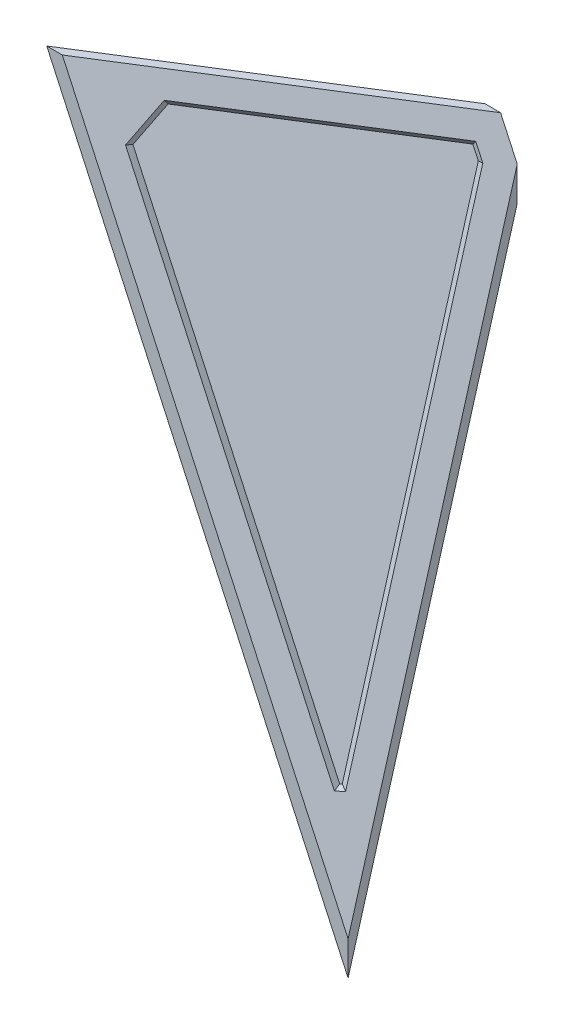
ISO-10303-21;
HEADER;
FILE_DESCRIPTION(('STEP AP214'),'2;1');
FILE_NAME('part.step','',(''),(''),'','','');
FILE_SCHEMA(('AUTOMOTIVE_DESIGN { 1 0 10303 214 1 1 1 1 }'));
ENDSEC;
DATA;
#1=APPLICATION_CONTEXT('core data for automotive mechanical design processes');
#2=APPLICATION_PROTOCOL_DEFINITION('international standard','automotive_design',2000,#1);
#3=PRODUCT_CONTEXT('',#1,'mechanical');
#4=PRODUCT('Part','Part','',(#3));
#5=PRODUCT_RELATED_PRODUCT_CATEGORY('part','',(#4));
#6=PRODUCT_DEFINITION_FORMATION('','',#4);
#7=PRODUCT_DEFINITION_CONTEXT('part definition',#1,'design');
#8=PRODUCT_DEFINITION('design','',#6,#7);
#9=PRODUCT_DEFINITION_SHAPE('','',#8);
#10=(LENGTH_UNIT() NAMED_UNIT(*) SI_UNIT(.MILLI.,.METRE.));
#11=(NAMED_UNIT(*) PLANE_ANGLE_UNIT() SI_UNIT($,.RADIAN.));
#12=(NAMED_UNIT(*) SI_UNIT($,.STERADIAN.) SOLID_ANGLE_UNIT());
#13=UNCERTAINTY_MEASURE_WITH_UNIT(LENGTH_MEASURE(1.E-05),#10,'distance_accuracy_value','');
#14=(GEOMETRIC_REPRESENTATION_CONTEXT(3) GLOBAL_UNCERTAINTY_ASSIGNED_CONTEXT((#13)) GLOBAL_UNIT_ASSIGNED_CONTEXT((#10,
#11,#12)) REPRESENTATION_CONTEXT('',''));
#15=CARTESIAN_POINT('',(0.,0.,0.));
#16=DIRECTION('',(0.,0.,1.));
#17=DIRECTION('',(1.,0.,0.));
#18=AXIS2_PLACEMENT_3D('',#15,#16,#17);
#19=CARTESIAN_POINT('',(0.,0.,-210.));
#20=DIRECTION('',(1.,0.,0.));
#21=DIRECTION('',(0.,1.,0.));
#22=AXIS2_PLACEMENT_3D('',#19,#20,#21);
#23=PLANE('',#22);
#24=DIRECTION('',(0.,0.960809103615452,-0.277210869934193));
#25=VECTOR('',#24,1.);
#26=CARTESIAN_POINT('',(0.,59.1712287943851,-4.91332604939326));
#27=LINE('',#26,#25);
#28=CARTESIAN_POINT('',(0.,42.1417075551616,0.));
#29=VERTEX_POINT('',#28);
#30=CARTESIAN_POINT('',(0.,769.998850412304,-210.));
#31=VERTEX_POINT('',#30);
#32=EDGE_CURVE('E148',#29,#31,#27,.T.);
#33=ORIENTED_EDGE('',*,*,#32,.F.);
#34=DIRECTION('',(0.,1.,0.));
#35=VECTOR('',#34,1.);
#36=CARTESIAN_POINT('',(0.,0.,0.));
#37=LINE('',#36,#35);
#38=CARTESIAN_POINT('',(0.,0.,0.));
#39=VERTEX_POINT('',#38);
#40=EDGE_CURVE('E169',#39,#29,#37,.T.);
#41=ORIENTED_EDGE('',*,*,#40,.F.);
#42=DIRECTION('',(0.,0.960809103615452,-0.277210869934193));
#43=VECTOR('',#42,1.);
#44=CARTESIAN_POINT('',(0.,55.9328127653257,-16.1376319460311));
#45=LINE('',#44,#43);
#46=CARTESIAN_POINT('',(0.,727.857142857143,-210.));
#47=VERTEX_POINT('',#46);
#48=EDGE_CURVE('E153',#39,#47,#45,.T.);
#49=ORIENTED_EDGE('',*,*,#48,.T.);
#50=DIRECTION('',(0.,1.,0.));
#51=VECTOR('',#50,1.);
#52=CARTESIAN_POINT('',(0.,0.,-210.));
#53=LINE('',#52,#51);
#54=EDGE_CURVE('E160',#47,#31,#53,.T.);
#55=ORIENTED_EDGE('',*,*,#54,.T.);
#56=EDGE_LOOP('',(#33,#41,#49,#55));
#57=FACE_BOUND('',#56,.T.);
#58=ADVANCED_FACE('F33',(#57),#23,.T.);
#59=CARTESIAN_POINT('',(0.,0.,-210.));
#60=DIRECTION('',(0.,0.,-1.));
#61=DIRECTION('',(-1.,0.,0.));
#62=AXIS2_PLACEMENT_3D('',#59,#60,#61);
#63=PLANE('',#62);
#64=DIRECTION('',(-0.417167660330651,0.908829545720346,0.));
#65=VECTOR('',#64,1.);
#66=CARTESIAN_POINT('',(291.932971477073,134.002019694394,-210.));
#67=LINE('',#66,#65);
#68=CARTESIAN_POINT('',(-20.6562653845149,815.,-210.000000000001));
#69=VERTEX_POINT('',#68);
#70=EDGE_CURVE('E146',#31,#69,#67,.T.);
#71=ORIENTED_EDGE('',*,*,#70,.F.);
#72=ORIENTED_EDGE('',*,*,#54,.F.);
#73=DIRECTION('',(-0.417167660330651,0.908829545720346,0.));
#74=VECTOR('',#73,1.);
#75=CARTESIAN_POINT('',(275.955604883463,126.668146503885,-210.));
#76=LINE('',#75,#74);
#77=CARTESIAN_POINT('',(-40.,815.,-210.));
#78=VERTEX_POINT('',#77);
#79=EDGE_CURVE('E150',#47,#78,#76,.T.);
#80=ORIENTED_EDGE('',*,*,#79,.T.);
#81=DIRECTION('',(-1.,0.,0.));
#82=VECTOR('',#81,1.);
#83=CARTESIAN_POINT('',(0.,815.,-210.));
#84=LINE('',#83,#82);
#85=EDGE_CURVE('E163',#69,#78,#84,.T.);
#86=ORIENTED_EDGE('',*,*,#85,.F.);
#87=EDGE_LOOP('',(#71,#72,#80,#86));
#88=FACE_BOUND('',#87,.T.);
#89=ADVANCED_FACE('F201',(#88),#63,.T.);
#90=CARTESIAN_POINT('',(0.,815.,-210.));
#91=DIRECTION('',(0.,1.,0.));
#92=DIRECTION('',(0.,0.,1.));
#93=AXIS2_PLACEMENT_3D('',#90,#91,#92);
#94=PLANE('',#93);
#95=DIRECTION('',(-0.846641896981035,0.,0.53216303730751));
#96=VECTOR('',#95,1.);
#97=CARTESIAN_POINT('',(-5.84980268062743,815.,-219.306711836939));
#98=LINE('',#97,#96);
#99=CARTESIAN_POINT('',(-354.754626040254,815.,0.));
#100=VERTEX_POINT('',#99);
#101=EDGE_CURVE('E144',#69,#100,#98,.T.);
#102=ORIENTED_EDGE('',*,*,#101,.F.);
#103=ORIENTED_EDGE('',*,*,#85,.T.);
#104=DIRECTION('',(0.846641896981035,0.,-0.53216303730751));
#105=VECTOR('',#104,1.);
#106=CARTESIAN_POINT('',(-40.,815.,-210.));
#107=LINE('',#106,#105);
#108=CARTESIAN_POINT('',(-374.098360655738,815.,0.));
#109=VERTEX_POINT('',#108);
#110=EDGE_CURVE('E156',#109,#78,#107,.T.);
#111=ORIENTED_EDGE('',*,*,#110,.F.);
#112=DIRECTION('',(-1.,0.,0.));
#113=VECTOR('',#112,1.);
#114=CARTESIAN_POINT('',(0.,815.,0.));
#115=LINE('',#114,#113);
#116=EDGE_CURVE('E164',#100,#109,#115,.T.);
#117=ORIENTED_EDGE('',*,*,#116,.F.);
#118=EDGE_LOOP('',(#102,#103,#111,#117));
#119=FACE_BOUND('',#118,.T.);
#120=ADVANCED_FACE('F207',(#119),#94,.T.);
#121=CARTESIAN_POINT('',(0.,0.,0.));
#122=DIRECTION('',(0.,0.,-1.));
#123=DIRECTION('',(-1.,0.,0.));
#124=AXIS2_PLACEMENT_3D('',#121,#122,#123);
#125=PLANE('',#124);
#126=ORIENTED_EDGE('',*,*,#40,.T.);
#127=DIRECTION('',(-0.417167660330651,0.908829545720346,0.));
#128=VECTOR('',#127,1.);
#129=CARTESIAN_POINT('',(15.9773665936107,7.33387319050981,0.));
#130=LINE('',#129,#128);
#131=EDGE_CURVE('E166',#29,#100,#130,.T.);
#132=ORIENTED_EDGE('',*,*,#131,.T.);
#133=ORIENTED_EDGE('',*,*,#116,.T.);
#134=DIRECTION('',(0.417167660330651,-0.908829545720346,0.));
#135=VECTOR('',#134,1.);
#136=CARTESIAN_POINT('',(-374.098360655738,815.,0.));
#137=LINE('',#136,#135);
#138=EDGE_CURVE('E159',#109,#39,#137,.T.);
#139=ORIENTED_EDGE('',*,*,#138,.T.);
#140=EDGE_LOOP('',(#126,#132,#133,#139));
#141=FACE_BOUND('',#140,.T.);
#142=ADVANCED_FACE('F277',(#141),#125,.F.);
#143=CARTESIAN_POINT('',(0.,0.,0.));
#144=DIRECTION('',(-0.516963254448049,-0.237294608599104,-0.822459884906419));
#145=DIRECTION('',(-0.846641896981035,0.,0.53216303730751));
#146=AXIS2_PLACEMENT_3D('',#143,#144,#145);
#147=PLANE('',#146);
#148=ORIENTED_EDGE('',*,*,#138,.F.);
#149=ORIENTED_EDGE('',*,*,#110,.T.);
#150=ORIENTED_EDGE('',*,*,#79,.F.);
#151=ORIENTED_EDGE('',*,*,#48,.F.);
#152=EDGE_LOOP('',(#148,#149,#150,#151));
#153=FACE_BOUND('',#152,.T.);
#154=ADVANCED_FACE('F269',(#153),#147,.T.);
#155=CARTESIAN_POINT('',(5.16963254448048,2.37294608599104,8.22459884906418));
#156=DIRECTION('',(-0.516963254448049,-0.237294608599104,-0.822459884906419));
#157=DIRECTION('',(-0.846641896981035,0.,0.53216303730751));
#158=AXIS2_PLACEMENT_3D('',#155,#156,#157);
#159=PLANE('',#158);
#160=DIRECTION('',(-0.417167660330629,0.908829545720356,0.));
#161=VECTOR('',#160,1.);
#162=CARTESIAN_POINT('',(-25.6802276897117,766.799065268607,-192.935306508825));
#163=LINE('',#162,#161);
#164=CARTESIAN_POINT('',(-25.6802276897117,766.799065268607,-192.935306508825));
#165=VERTEX_POINT('',#164);
#166=CARTESIAN_POINT('',(-34.4280715736029,785.856868015657,-192.935306508826));
#167=VERTEX_POINT('',#166);
#168=EDGE_CURVE('E114',#165,#167,#163,.T.);
#169=ORIENTED_EDGE('',*,*,#168,.F.);
#170=DIRECTION('',(0.,0.960809103615451,-0.277210869934193));
#171=VECTOR('',#170,1.);
#172=CARTESIAN_POINT('',(-25.6802276897117,176.450095419198,-22.608910889859));
#173=LINE('',#172,#171);
#174=CARTESIAN_POINT('',(-25.6802276897117,176.450095419198,-22.608910889859));
#175=VERTEX_POINT('',#174);
#176=EDGE_CURVE('E133',#175,#165,#173,.T.);
#177=ORIENTED_EDGE('',*,*,#176,.F.);
#178=DIRECTION('',(0.828430440270626,0.103223361077464,-0.550497904955949));
#179=VECTOR('',#178,1.);
#180=CARTESIAN_POINT('',(-34.0235808963247,175.410504261295,-17.0646934911749));
#181=LINE('',#180,#179);
#182=CARTESIAN_POINT('',(-34.0235808963247,175.410504261295,-17.0646934911749));
#183=VERTEX_POINT('',#182);
#184=EDGE_CURVE('E141',#183,#175,#181,.T.);
#185=ORIENTED_EDGE('',*,*,#184,.F.);
#186=DIRECTION('',(0.417167660330651,-0.908829545720346,0.));
#187=VECTOR('',#186,1.);
#188=CARTESIAN_POINT('',(-293.370086160483,740.41539072964,-17.0646934911749));
#189=LINE('',#188,#187);
#190=CARTESIAN_POINT('',(-293.370086160483,740.41539072964,-17.0646934911749));
#191=VERTEX_POINT('',#190);
#192=EDGE_CURVE('E138',#191,#183,#189,.T.);
#193=ORIENTED_EDGE('',*,*,#192,.F.);
#194=DIRECTION('',(-0.377602011727389,-0.799060422012361,0.467887980945071));
#195=VECTOR('',#194,1.);
#196=CARTESIAN_POINT('',(-271.896374327964,785.856868015657,-43.6728453565504));
#197=LINE('',#196,#195);
#198=CARTESIAN_POINT('',(-271.896374327964,785.856868015657,-43.6728453565504));
#199=VERTEX_POINT('',#198);
#200=EDGE_CURVE('E117',#199,#191,#197,.T.);
#201=ORIENTED_EDGE('',*,*,#200,.F.);
#202=DIRECTION('',(-0.846641896981035,0.,0.53216303730751));
#203=VECTOR('',#202,1.);
#204=CARTESIAN_POINT('',(-34.4280715736029,785.856868015657,-192.935306508826));
#205=LINE('',#204,#203);
#206=EDGE_CURVE('E109',#167,#199,#205,.T.);
#207=ORIENTED_EDGE('',*,*,#206,.F.);
#208=EDGE_LOOP('',(#169,#177,#185,#193,#201,#207));
#209=FACE_BOUND('',#208,.T.);
#210=ORIENTED_EDGE('',*,*,#32,.T.);
#211=ORIENTED_EDGE('',*,*,#70,.T.);
#212=ORIENTED_EDGE('',*,*,#101,.T.);
#213=ORIENTED_EDGE('',*,*,#131,.F.);
#214=EDGE_LOOP('',(#210,#211,#212,#213));
#215=FACE_BOUND('',#214,.T.);
#216=ADVANCED_FACE('F111',(#209,#215),#159,.F.);
#217=CARTESIAN_POINT('',(2.58481627224022,1.18647304299551,4.11229942453206));
#218=DIRECTION('',(0.516963254448049,0.237294608599104,0.822459884906419));
#219=DIRECTION('',(0.846641896981035,0.,-0.532163037307511));
#220=AXIS2_PLACEMENT_3D('',#217,#218,#219);
#221=PLANE('',#220);
#222=DIRECTION('',(0.417167660330651,-0.908829545720346,0.));
#223=VECTOR('',#222,1.);
#224=CARTESIAN_POINT('',(39.5542048464153,18.1560284540922,-24.0211084975696));
#225=LINE('',#224,#223);
#226=CARTESIAN_POINT('',(-291.123795628641,738.56167234618,-24.0211084975696));
#227=VERTEX_POINT('',#226);
#228=CARTESIAN_POINT('',(-34.4836318059048,179.452744018075,-24.0211084975696));
#229=VERTEX_POINT('',#228);
#230=EDGE_CURVE('E42',#227,#229,#225,.T.);
#231=ORIENTED_EDGE('',*,*,#230,.T.);
#232=DIRECTION('',(0.828430440270626,0.103223361077464,-0.550497904955948));
#233=VECTOR('',#232,1.);
#234=CARTESIAN_POINT('',(-37.1180364767824,179.12449424435,-22.2705279036811));
#235=LINE('',#234,#233);
#236=CARTESIAN_POINT('',(-32.5450819102373,179.694289507135,-25.3092886565084));
#237=VERTEX_POINT('',#236);
#238=EDGE_CURVE('E11',#229,#237,#235,.T.);
#239=ORIENTED_EDGE('',*,*,#238,.T.);
#240=DIRECTION('',(0.,0.960809103615452,-0.277210869934193));
#241=VECTOR('',#240,1.);
#242=CARTESIAN_POINT('',(-32.5450819102373,7.06771715819836,24.4966115108984));
#243=LINE('',#242,#241);
#244=CARTESIAN_POINT('',(-32.5450819102373,765.079294701662,-194.203490351495));
#245=VERTEX_POINT('',#244);
#246=EDGE_CURVE('E175',#237,#245,#243,.T.);
#247=ORIENTED_EDGE('',*,*,#246,.T.);
#248=DIRECTION('',(-0.417167660330629,0.908829545720356,0.));
#249=VECTOR('',#248,1.);
#250=CARTESIAN_POINT('',(263.186500679777,120.806918344805,-194.203490351483));
#251=LINE('',#250,#249);
#252=CARTESIAN_POINT('',(-39.3081888773581,779.813206308604,-194.203490351495));
#253=VERTEX_POINT('',#252);
#254=EDGE_CURVE('E177',#245,#253,#251,.T.);
#255=ORIENTED_EDGE('',*,*,#254,.T.);
#256=DIRECTION('',(-0.846641896981035,0.,0.532163037307511));
#257=VECTOR('',#256,1.);
#258=CARTESIAN_POINT('',(-98.6306591810956,779.813206308605,-156.915912108567));
#259=LINE('',#258,#257);
#260=CARTESIAN_POINT('',(-271.630073024005,779.813206308605,-48.1758487460703));
#261=VERTEX_POINT('',#260);
#262=EDGE_CURVE('E125',#253,#261,#259,.T.);
#263=ORIENTED_EDGE('',*,*,#262,.T.);
#264=DIRECTION('',(-0.377602011727389,-0.799060422012361,0.467887980945071));
#265=VECTOR('',#264,1.);
#266=CARTESIAN_POINT('',(-476.702217030184,345.850915739932,205.929766232485));
#267=LINE('',#266,#265);
#268=EDGE_CURVE('E53',#261,#227,#267,.T.);
#269=ORIENTED_EDGE('',*,*,#268,.T.);
#270=EDGE_LOOP('',(#231,#239,#247,#255,#263,#269));
#271=FACE_BOUND('',#270,.T.);
#272=ADVANCED_FACE('F199',(#271),#221,.T.);
#273=CARTESIAN_POINT('',(-98.6306591810955,779.813206308604,-156.915912108567));
#274=DIRECTION('',(-0.454841256802446,0.519117581492012,-0.72362722979187));
#275=DIRECTION('',(-0.846641896981035,0.,0.532163037307511));
#276=AXIS2_PLACEMENT_3D('',#273,#274,#275);
#277=PLANE('',#276);
#278=DIRECTION('',(-0.620027169514671,-0.767857456796114,-0.161124905294711));
#279=VECTOR('',#278,1.);
#280=CARTESIAN_POINT('',(-58.3886482002997,756.183478950554,-199.161881455219));
#281=LINE('',#280,#279);
#282=EDGE_CURVE('E124',#167,#253,#281,.T.);
#283=ORIENTED_EDGE('',*,*,#282,.F.);
#284=ORIENTED_EDGE('',*,*,#206,.T.);
#285=DIRECTION('',(0.0353115807329635,-0.801390173906372,-0.597098720005707));
#286=VECTOR('',#285,1.);
#287=CARTESIAN_POINT('',(-264.963050373229,628.506288559778,-160.911404855332));
#288=LINE('',#287,#286);
#289=EDGE_CURVE('E37',#261,#199,#288,.F.);
#290=ORIENTED_EDGE('',*,*,#289,.F.);
#291=ORIENTED_EDGE('',*,*,#262,.F.);
#292=EDGE_LOOP('',(#283,#284,#290,#291));
#293=FACE_BOUND('',#292,.T.);
#294=ADVANCED_FACE('F35',(#293),#277,.F.);
#295=CARTESIAN_POINT('',(-476.702217030183,345.850915739932,205.929766232484));
#296=DIRECTION('',(-0.908763518233846,0.222843847802089,-0.352830678121959));
#297=DIRECTION('',(-0.377602011727389,-0.799060422012361,0.467887980945071));
#298=AXIS2_PLACEMENT_3D('',#295,#296,#297);
#299=PLANE('',#298);
#300=ORIENTED_EDGE('',*,*,#289,.T.);
#301=ORIENTED_EDGE('',*,*,#200,.T.);
#302=DIRECTION('',(0.297858359255358,-0.245803251356941,-0.922421356780112));
#303=VECTOR('',#302,1.);
#304=CARTESIAN_POINT('',(-209.04199767394,670.824869978341,-278.21576539963));
#305=LINE('',#304,#303);
#306=EDGE_CURVE('E128',#227,#191,#305,.F.);
#307=ORIENTED_EDGE('',*,*,#306,.F.);
#308=ORIENTED_EDGE('',*,*,#268,.F.);
#309=EDGE_LOOP('',(#300,#301,#307,#308));
#310=FACE_BOUND('',#309,.T.);
#311=ADVANCED_FACE('F192',(#310),#299,.F.);
#312=CARTESIAN_POINT('',(263.186500679777,120.806918344805,-194.203490351483));
#313=DIRECTION('',(0.162997014918916,0.074818301929972,-0.983785644753896));
#314=DIRECTION('',(-0.417167660330629,0.908829545720356,0.));
#315=AXIS2_PLACEMENT_3D('',#312,#313,#314);
#316=PLANE('',#315);
#317=ORIENTED_EDGE('',*,*,#282,.T.);
#318=ORIENTED_EDGE('',*,*,#254,.F.);
#319=DIRECTION('',(-0.954814769400763,-0.239198427898172,-0.176388401617597));
#320=VECTOR('',#319,1.);
#321=CARTESIAN_POINT('',(89.9194062487829,795.758871494736,-171.579923966107));
#322=LINE('',#321,#320);
#323=EDGE_CURVE('E131',#165,#245,#322,.T.);
#324=ORIENTED_EDGE('',*,*,#323,.F.);
#325=ORIENTED_EDGE('',*,*,#168,.T.);
#326=EDGE_LOOP('',(#317,#318,#324,#325));
#327=FACE_BOUND('',#326,.T.);
#328=ADVANCED_FACE('F129',(#327),#316,.F.);
#329=CARTESIAN_POINT('',(39.5542048464153,18.1560284540923,-24.0211084975696));
#330=DIRECTION('',(-0.894093460607877,-0.410403555688862,-0.179348278988593));
#331=DIRECTION('',(0.417167660330651,-0.908829545720346,0.));
#332=AXIS2_PLACEMENT_3D('',#329,#330,#331);
#333=PLANE('',#332);
#334=ORIENTED_EDGE('',*,*,#306,.T.);
#335=ORIENTED_EDGE('',*,*,#192,.T.);
#336=DIRECTION('',(-0.0570873026973729,0.501597887897501,-0.863215267895271));
#337=VECTOR('',#336,1.);
#338=CARTESIAN_POINT('',(-34.3965516203107,178.687613505547,-22.7043718121041));
#339=LINE('',#338,#337);
#340=EDGE_CURVE('E184',#229,#183,#339,.F.);
#341=ORIENTED_EDGE('',*,*,#340,.F.);
#342=ORIENTED_EDGE('',*,*,#230,.F.);
#343=EDGE_LOOP('',(#334,#335,#341,#342));
#344=FACE_BOUND('',#343,.T.);
#345=ADVANCED_FACE('F189',(#344),#333,.F.);
#346=CARTESIAN_POINT('',(-32.5450819102374,7.06771715819836,24.4966115108984));
#347=DIRECTION('',(0.239740548549168,-0.269126567737052,-0.932789022190665));
#348=DIRECTION('',(0.,0.960809103615452,-0.277210869934193));
#349=AXIS2_PLACEMENT_3D('',#346,#347,#348);
#350=PLANE('',#349);
#351=ORIENTED_EDGE('',*,*,#323,.T.);
#352=ORIENTED_EDGE('',*,*,#246,.F.);
#353=DIRECTION('',(0.85185357250623,-0.402569120178815,0.335087443045585));
#354=VECTOR('',#353,1.);
#355=CARTESIAN_POINT('',(-34.8006667674086,180.760234219638,-26.1965516636213));
#356=LINE('',#355,#354);
#357=EDGE_CURVE('E182',#175,#237,#356,.F.);
#358=ORIENTED_EDGE('',*,*,#357,.F.);
#359=ORIENTED_EDGE('',*,*,#176,.T.);
#360=EDGE_LOOP('',(#351,#352,#358,#359));
#361=FACE_BOUND('',#360,.T.);
#362=ADVANCED_FACE('F217',(#361),#350,.F.);
#363=CARTESIAN_POINT('',(-37.1180364767824,179.12449424435,-22.2705279036811));
#364=DIRECTION('',(-0.213147436784347,-0.850813931985524,-0.480295558309251));
#365=DIRECTION('',(0.828430440270626,0.103223361077464,-0.550497904955948));
#366=AXIS2_PLACEMENT_3D('',#363,#364,#365);
#367=PLANE('',#366);
#368=ORIENTED_EDGE('',*,*,#340,.T.);
#369=ORIENTED_EDGE('',*,*,#184,.T.);
#370=ORIENTED_EDGE('',*,*,#357,.T.);
#371=ORIENTED_EDGE('',*,*,#238,.F.);
#372=EDGE_LOOP('',(#368,#369,#370,#371));
#373=FACE_BOUND('',#372,.T.);
#374=ADVANCED_FACE('F214',(#373),#367,.F.);
#375=CLOSED_SHELL('',(#58,#89,#120,#142,#154,#216,#272,#294,#311,#328,#345,#362,#374));
#376=MANIFOLD_SOLID_BREP('B2',#375);
#377=ADVANCED_BREP_SHAPE_REPRESENTATION('',(#18,#376),#14);
#378=SHAPE_DEFINITION_REPRESENTATION(#9,#377);
ENDSEC;
END-ISO-10303-21;
